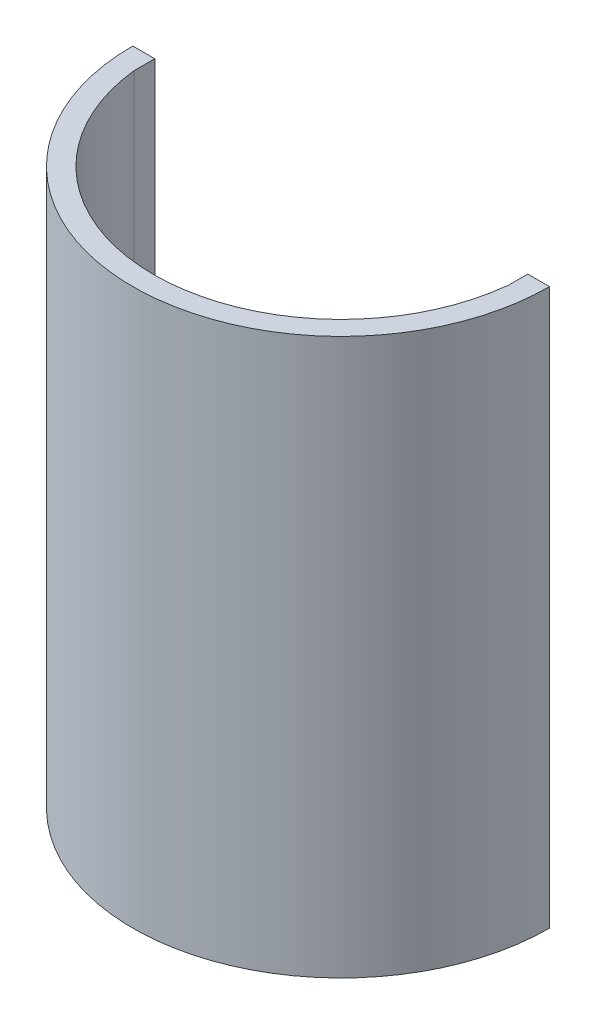
ISO-10303-21;
HEADER;
FILE_DESCRIPTION(('STEP AP214'),'2;1');
FILE_NAME('part.step','',(''),(''),'','','');
FILE_SCHEMA(('AUTOMOTIVE_DESIGN { 1 0 10303 214 1 1 1 1 }'));
ENDSEC;
DATA;
#1=APPLICATION_CONTEXT('core data for automotive mechanical design processes');
#2=APPLICATION_PROTOCOL_DEFINITION('international standard','automotive_design',2000,#1);
#3=PRODUCT_CONTEXT('',#1,'mechanical');
#4=PRODUCT('Part','Part','',(#3));
#5=PRODUCT_RELATED_PRODUCT_CATEGORY('part','',(#4));
#6=PRODUCT_DEFINITION_FORMATION('','',#4);
#7=PRODUCT_DEFINITION_CONTEXT('part definition',#1,'design');
#8=PRODUCT_DEFINITION('design','',#6,#7);
#9=PRODUCT_DEFINITION_SHAPE('','',#8);
#10=(LENGTH_UNIT() NAMED_UNIT(*) SI_UNIT(.MILLI.,.METRE.));
#11=(NAMED_UNIT(*) PLANE_ANGLE_UNIT() SI_UNIT($,.RADIAN.));
#12=(NAMED_UNIT(*) SI_UNIT($,.STERADIAN.) SOLID_ANGLE_UNIT());
#13=UNCERTAINTY_MEASURE_WITH_UNIT(LENGTH_MEASURE(1.E-05),#10,'distance_accuracy_value','');
#14=(GEOMETRIC_REPRESENTATION_CONTEXT(3) GLOBAL_UNCERTAINTY_ASSIGNED_CONTEXT((#13)) GLOBAL_UNIT_ASSIGNED_CONTEXT((#10,
#11,#12)) REPRESENTATION_CONTEXT('',''));
#15=CARTESIAN_POINT('',(0.,0.,0.));
#16=DIRECTION('',(0.,0.,1.));
#17=DIRECTION('',(1.,0.,0.));
#18=AXIS2_PLACEMENT_3D('',#15,#16,#17);
#19=CARTESIAN_POINT('',(-76.2,203.2,0.));
#20=DIRECTION('',(0.,0.,1.));
#21=DIRECTION('',(1.,0.,0.));
#22=AXIS2_PLACEMENT_3D('',#19,#20,#21);
#23=PLANE('',#22);
#24=DIRECTION('',(-1.,0.,0.));
#25=VECTOR('',#24,1.);
#26=CARTESIAN_POINT('',(-76.2,203.2,0.));
#27=LINE('',#26,#25);
#28=CARTESIAN_POINT('',(-68.1553519541936,203.2,0.));
#29=VERTEX_POINT('',#28);
#30=CARTESIAN_POINT('',(-76.2,203.2,0.));
#31=VERTEX_POINT('',#30);
#32=EDGE_CURVE('E63',#29,#31,#27,.T.);
#33=ORIENTED_EDGE('',*,*,#32,.F.);
#34=DIRECTION('',(0.,1.,0.));
#35=VECTOR('',#34,1.);
#36=CARTESIAN_POINT('',(-68.1553519541936,0.,0.));
#37=LINE('',#36,#35);
#38=CARTESIAN_POINT('',(-68.1553519541936,0.,0.));
#39=VERTEX_POINT('',#38);
#40=EDGE_CURVE('E140',#39,#29,#37,.T.);
#41=ORIENTED_EDGE('',*,*,#40,.F.);
#42=DIRECTION('',(-1.,0.,0.));
#43=VECTOR('',#42,1.);
#44=CARTESIAN_POINT('',(-76.2,0.,0.));
#45=LINE('',#44,#43);
#46=CARTESIAN_POINT('',(-76.2,0.,0.));
#47=VERTEX_POINT('',#46);
#48=EDGE_CURVE('E129',#39,#47,#45,.T.);
#49=ORIENTED_EDGE('',*,*,#48,.T.);
#50=DIRECTION('',(0.,-1.,0.));
#51=VECTOR('',#50,1.);
#52=CARTESIAN_POINT('',(-76.2,203.2,0.));
#53=LINE('',#52,#51);
#54=EDGE_CURVE('E55',#31,#47,#53,.T.);
#55=ORIENTED_EDGE('',*,*,#54,.F.);
#56=EDGE_LOOP('',(#33,#41,#49,#55));
#57=FACE_BOUND('',#56,.T.);
#58=ADVANCED_FACE('F45',(#57),#23,.F.);
#59=CARTESIAN_POINT('',(0.,203.2,0.));
#60=DIRECTION('',(0.,-1.,0.));
#61=DIRECTION('',(0.,0.,-1.));
#62=AXIS2_PLACEMENT_3D('',#59,#60,#61);
#63=CYLINDRICAL_SURFACE('',#62,76.2);
#64=CARTESIAN_POINT('',(0.,0.,0.));
#65=DIRECTION('',(0.,1.,0.));
#66=DIRECTION('',(0.,0.,1.));
#67=AXIS2_PLACEMENT_3D('',#64,#65,#66);
#68=CIRCLE('',#67,76.2);
#69=CARTESIAN_POINT('',(76.2,0.,0.));
#70=VERTEX_POINT('',#69);
#71=EDGE_CURVE('E122',#47,#70,#68,.T.);
#72=ORIENTED_EDGE('',*,*,#71,.T.);
#73=DIRECTION('',(0.,-1.,0.));
#74=VECTOR('',#73,1.);
#75=CARTESIAN_POINT('',(76.2,203.2,0.));
#76=LINE('',#75,#74);
#77=CARTESIAN_POINT('',(76.2,203.2,0.));
#78=VERTEX_POINT('',#77);
#79=EDGE_CURVE('E11',#78,#70,#76,.T.);
#80=ORIENTED_EDGE('',*,*,#79,.F.);
#81=CARTESIAN_POINT('',(0.,203.2,0.));
#82=DIRECTION('',(0.,1.,0.));
#83=DIRECTION('',(0.,0.,1.));
#84=AXIS2_PLACEMENT_3D('',#81,#82,#83);
#85=CIRCLE('',#84,76.2);
#86=EDGE_CURVE('E146',#31,#78,#85,.T.);
#87=ORIENTED_EDGE('',*,*,#86,.F.);
#88=ORIENTED_EDGE('',*,*,#54,.T.);
#89=EDGE_LOOP('',(#72,#80,#87,#88));
#90=FACE_BOUND('',#89,.T.);
#91=ADVANCED_FACE('F47',(#90),#63,.T.);
#92=CARTESIAN_POINT('',(68.2658032291854,0.,0.));
#93=VERTEX_POINT('',#92);
#94=EDGE_CURVE('E75',#70,#93,#45,.T.);
#95=ORIENTED_EDGE('',*,*,#94,.T.);
#96=DIRECTION('',(0.,1.,0.));
#97=VECTOR('',#96,1.);
#98=CARTESIAN_POINT('',(68.2658032291854,0.,0.));
#99=LINE('',#98,#97);
#100=CARTESIAN_POINT('',(68.2658032291854,203.2,0.));
#101=VERTEX_POINT('',#100);
#102=EDGE_CURVE('E166',#93,#101,#99,.T.);
#103=ORIENTED_EDGE('',*,*,#102,.T.);
#104=EDGE_CURVE('E149',#78,#101,#27,.T.);
#105=ORIENTED_EDGE('',*,*,#104,.F.);
#106=ORIENTED_EDGE('',*,*,#79,.T.);
#107=EDGE_LOOP('',(#95,#103,#105,#106));
#108=FACE_BOUND('',#107,.T.);
#109=ADVANCED_FACE('F186',(#108),#23,.F.);
#110=CARTESIAN_POINT('',(0.,203.2,0.));
#111=DIRECTION('',(0.,1.,0.));
#112=DIRECTION('',(0.,0.,1.));
#113=AXIS2_PLACEMENT_3D('',#110,#111,#112);
#114=PLANE('',#113);
#115=DIRECTION('',(0.,0.,1.));
#116=VECTOR('',#115,1.);
#117=CARTESIAN_POINT('',(-68.1553519541936,203.2,7.62));
#118=LINE('',#117,#116);
#119=CARTESIAN_POINT('',(-68.1553519541936,203.2,7.62));
#120=VERTEX_POINT('',#119);
#121=EDGE_CURVE('E116',#29,#120,#118,.T.);
#122=ORIENTED_EDGE('',*,*,#121,.F.);
#123=ORIENTED_EDGE('',*,*,#32,.T.);
#124=ORIENTED_EDGE('',*,*,#86,.T.);
#125=ORIENTED_EDGE('',*,*,#104,.T.);
#126=DIRECTION('',(0.,0.,-1.));
#127=VECTOR('',#126,1.);
#128=CARTESIAN_POINT('',(68.2658032291854,203.2,7.62));
#129=LINE('',#128,#127);
#130=CARTESIAN_POINT('',(68.2658032291854,203.2,7.62));
#131=VERTEX_POINT('',#130);
#132=EDGE_CURVE('E131',#131,#101,#129,.T.);
#133=ORIENTED_EDGE('',*,*,#132,.F.);
#134=DIRECTION('',(1.,0.,0.));
#135=VECTOR('',#134,1.);
#136=CARTESIAN_POINT('',(-68.1553519541936,203.2,7.62));
#137=LINE('',#136,#135);
#138=CARTESIAN_POINT('',(68.1553519541936,203.2,7.62));
#139=VERTEX_POINT('',#138);
#140=EDGE_CURVE('E173',#139,#131,#137,.T.);
#141=ORIENTED_EDGE('',*,*,#140,.F.);
#142=CARTESIAN_POINT('',(0.,203.2,0.));
#143=DIRECTION('',(0.,1.,0.));
#144=DIRECTION('',(0.,0.,1.));
#145=AXIS2_PLACEMENT_3D('',#142,#143,#144);
#146=CIRCLE('',#145,68.58);
#147=EDGE_CURVE('E135',#120,#139,#146,.T.);
#148=ORIENTED_EDGE('',*,*,#147,.F.);
#149=EDGE_LOOP('',(#122,#123,#124,#125,#133,#141,#148));
#150=FACE_BOUND('',#149,.T.);
#151=ADVANCED_FACE('F188',(#150),#114,.T.);
#152=CARTESIAN_POINT('',(0.,0.,0.));
#153=DIRECTION('',(0.,1.,0.));
#154=DIRECTION('',(0.,0.,1.));
#155=AXIS2_PLACEMENT_3D('',#152,#153,#154);
#156=PLANE('',#155);
#157=ORIENTED_EDGE('',*,*,#48,.F.);
#158=DIRECTION('',(0.,0.,1.));
#159=VECTOR('',#158,1.);
#160=CARTESIAN_POINT('',(-68.1553519541936,0.,7.62));
#161=LINE('',#160,#159);
#162=CARTESIAN_POINT('',(-68.1553519541936,0.,7.62));
#163=VERTEX_POINT('',#162);
#164=EDGE_CURVE('E114',#39,#163,#161,.T.);
#165=ORIENTED_EDGE('',*,*,#164,.T.);
#166=CARTESIAN_POINT('',(0.,0.,0.));
#167=DIRECTION('',(0.,1.,0.));
#168=DIRECTION('',(0.,0.,1.));
#169=AXIS2_PLACEMENT_3D('',#166,#167,#168);
#170=CIRCLE('',#169,68.58);
#171=CARTESIAN_POINT('',(68.1553519541936,0.,7.62));
#172=VERTEX_POINT('',#171);
#173=EDGE_CURVE('E128',#163,#172,#170,.T.);
#174=ORIENTED_EDGE('',*,*,#173,.T.);
#175=DIRECTION('',(1.,0.,0.));
#176=VECTOR('',#175,1.);
#177=CARTESIAN_POINT('',(-68.1553519541936,0.,7.62));
#178=LINE('',#177,#176);
#179=CARTESIAN_POINT('',(68.2658032291854,0.,7.62));
#180=VERTEX_POINT('',#179);
#181=EDGE_CURVE('E84',#172,#180,#178,.T.);
#182=ORIENTED_EDGE('',*,*,#181,.T.);
#183=DIRECTION('',(0.,0.,-1.));
#184=VECTOR('',#183,1.);
#185=CARTESIAN_POINT('',(68.2658032291854,0.,7.62));
#186=LINE('',#185,#184);
#187=EDGE_CURVE('E178',#180,#93,#186,.T.);
#188=ORIENTED_EDGE('',*,*,#187,.T.);
#189=ORIENTED_EDGE('',*,*,#94,.F.);
#190=ORIENTED_EDGE('',*,*,#71,.F.);
#191=EDGE_LOOP('',(#157,#165,#174,#182,#188,#189,#190));
#192=FACE_BOUND('',#191,.T.);
#193=ADVANCED_FACE('F127',(#192),#156,.F.);
#194=CARTESIAN_POINT('',(0.,0.,0.));
#195=DIRECTION('',(0.,1.,0.));
#196=DIRECTION('',(0.,0.,1.));
#197=AXIS2_PLACEMENT_3D('',#194,#195,#196);
#198=CYLINDRICAL_SURFACE('',#197,68.58);
#199=ORIENTED_EDGE('',*,*,#147,.T.);
#200=DIRECTION('',(0.,1.,0.));
#201=VECTOR('',#200,1.);
#202=CARTESIAN_POINT('',(68.1553519541936,0.,7.62));
#203=LINE('',#202,#201);
#204=EDGE_CURVE('E123',#172,#139,#203,.T.);
#205=ORIENTED_EDGE('',*,*,#204,.F.);
#206=ORIENTED_EDGE('',*,*,#173,.F.);
#207=DIRECTION('',(0.,1.,0.));
#208=VECTOR('',#207,1.);
#209=CARTESIAN_POINT('',(-68.1553519541936,0.,7.62));
#210=LINE('',#209,#208);
#211=EDGE_CURVE('E111',#163,#120,#210,.T.);
#212=ORIENTED_EDGE('',*,*,#211,.T.);
#213=EDGE_LOOP('',(#199,#205,#206,#212));
#214=FACE_BOUND('',#213,.T.);
#215=ADVANCED_FACE('F133',(#214),#198,.F.);
#216=CARTESIAN_POINT('',(-68.1553519541936,0.,7.62));
#217=DIRECTION('',(-1.,0.,0.));
#218=DIRECTION('',(0.,0.,1.));
#219=AXIS2_PLACEMENT_3D('',#216,#217,#218);
#220=PLANE('',#219);
#221=ORIENTED_EDGE('',*,*,#121,.T.);
#222=ORIENTED_EDGE('',*,*,#211,.F.);
#223=ORIENTED_EDGE('',*,*,#164,.F.);
#224=ORIENTED_EDGE('',*,*,#40,.T.);
#225=EDGE_LOOP('',(#221,#222,#223,#224));
#226=FACE_BOUND('',#225,.T.);
#227=ADVANCED_FACE('F113',(#226),#220,.F.);
#228=CARTESIAN_POINT('',(-68.1553519541936,0.,7.62));
#229=DIRECTION('',(0.,0.,1.));
#230=DIRECTION('',(1.,0.,0.));
#231=AXIS2_PLACEMENT_3D('',#228,#229,#230);
#232=PLANE('',#231);
#233=ORIENTED_EDGE('',*,*,#140,.T.);
#234=DIRECTION('',(0.,1.,0.));
#235=VECTOR('',#234,1.);
#236=CARTESIAN_POINT('',(68.2658032291854,0.,7.62));
#237=LINE('',#236,#235);
#238=EDGE_CURVE('E143',#180,#131,#237,.T.);
#239=ORIENTED_EDGE('',*,*,#238,.F.);
#240=ORIENTED_EDGE('',*,*,#181,.F.);
#241=ORIENTED_EDGE('',*,*,#204,.T.);
#242=EDGE_LOOP('',(#233,#239,#240,#241));
#243=FACE_BOUND('',#242,.T.);
#244=ADVANCED_FACE('F240',(#243),#232,.F.);
#245=CARTESIAN_POINT('',(68.2658032291854,0.,7.62));
#246=DIRECTION('',(1.,0.,0.));
#247=DIRECTION('',(0.,0.,-1.));
#248=AXIS2_PLACEMENT_3D('',#245,#246,#247);
#249=PLANE('',#248);
#250=ORIENTED_EDGE('',*,*,#132,.T.);
#251=ORIENTED_EDGE('',*,*,#102,.F.);
#252=ORIENTED_EDGE('',*,*,#187,.F.);
#253=ORIENTED_EDGE('',*,*,#238,.T.);
#254=EDGE_LOOP('',(#250,#251,#252,#253));
#255=FACE_BOUND('',#254,.T.);
#256=ADVANCED_FACE('F249',(#255),#249,.F.);
#257=CLOSED_SHELL('',(#58,#91,#109,#151,#193,#215,#227,#244,#256));
#258=MANIFOLD_SOLID_BREP('B2',#257);
#259=ADVANCED_BREP_SHAPE_REPRESENTATION('',(#18,#258),#14);
#260=SHAPE_DEFINITION_REPRESENTATION(#9,#259);
ENDSEC;
END-ISO-10303-21;
